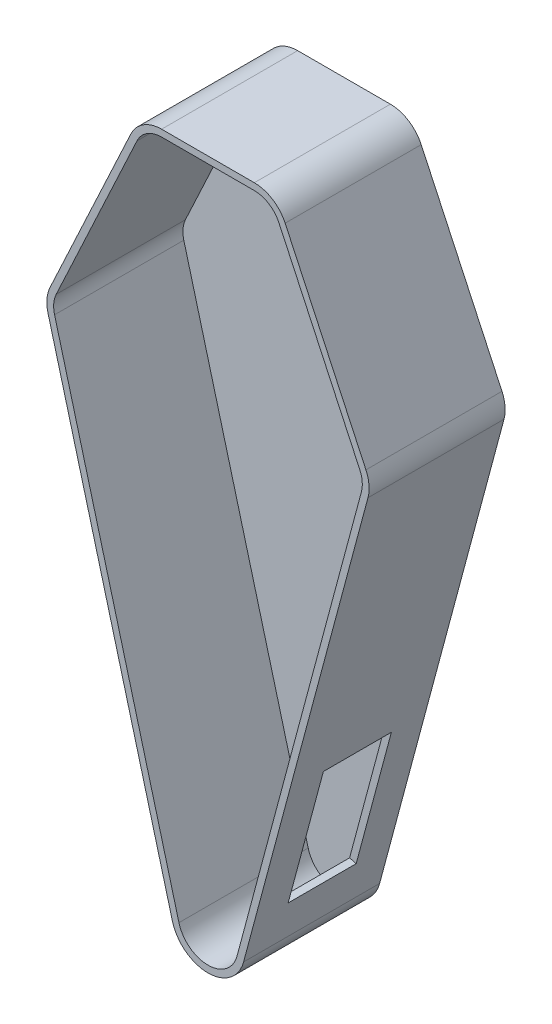
ISO-10303-21;
HEADER;
FILE_DESCRIPTION(('STEP AP214'),'2;1');
FILE_NAME('part.step','',(''),(''),'','','');
FILE_SCHEMA(('AUTOMOTIVE_DESIGN { 1 0 10303 214 1 1 1 1 }'));
ENDSEC;
DATA;
#1=APPLICATION_CONTEXT('core data for automotive mechanical design processes');
#2=APPLICATION_PROTOCOL_DEFINITION('international standard','automotive_design',2000,#1);
#3=PRODUCT_CONTEXT('',#1,'mechanical');
#4=PRODUCT('Part','Part','',(#3));
#5=PRODUCT_RELATED_PRODUCT_CATEGORY('part','',(#4));
#6=PRODUCT_DEFINITION_FORMATION('','',#4);
#7=PRODUCT_DEFINITION_CONTEXT('part definition',#1,'design');
#8=PRODUCT_DEFINITION('design','',#6,#7);
#9=PRODUCT_DEFINITION_SHAPE('','',#8);
#10=(LENGTH_UNIT() NAMED_UNIT(*) SI_UNIT(.MILLI.,.METRE.));
#11=(NAMED_UNIT(*) PLANE_ANGLE_UNIT() SI_UNIT($,.RADIAN.));
#12=(NAMED_UNIT(*) SI_UNIT($,.STERADIAN.) SOLID_ANGLE_UNIT());
#13=UNCERTAINTY_MEASURE_WITH_UNIT(LENGTH_MEASURE(1.E-05),#10,'distance_accuracy_value','');
#14=(GEOMETRIC_REPRESENTATION_CONTEXT(3) GLOBAL_UNCERTAINTY_ASSIGNED_CONTEXT((#13)) GLOBAL_UNIT_ASSIGNED_CONTEXT((#10,
#11,#12)) REPRESENTATION_CONTEXT('',''));
#15=CARTESIAN_POINT('',(0.,0.,0.));
#16=DIRECTION('',(0.,0.,1.));
#17=DIRECTION('',(1.,0.,0.));
#18=AXIS2_PLACEMENT_3D('',#15,#16,#17);
#19=CARTESIAN_POINT('',(0.,0.,20.));
#20=DIRECTION('',(-0.906307787036648,-0.422618261740704,0.));
#21=DIRECTION('',(0.422618261740704,-0.906307787036648,0.));
#22=AXIS2_PLACEMENT_3D('',#19,#20,#21);
#23=PLANE('',#22);
#24=DIRECTION('',(-0.422618261740704,0.906307787036648,0.));
#25=VECTOR('',#24,1.);
#26=CARTESIAN_POINT('',(0.,0.,20.));
#27=LINE('',#26,#25);
#28=CARTESIAN_POINT('',(13.2201274059954,-28.3506547121749,20.));
#29=VERTEX_POINT('',#28);
#30=CARTESIAN_POINT('',(1.34618763114579,-2.88690869129648,20.));
#31=VERTEX_POINT('',#30);
#32=EDGE_CURVE('E311',#29,#31,#27,.T.);
#33=ORIENTED_EDGE('',*,*,#32,.F.);
#34=DIRECTION('',(0.,0.,-1.));
#35=VECTOR('',#34,1.);
#36=CARTESIAN_POINT('',(13.2201274059954,-28.3506547121749,20.));
#37=LINE('',#36,#35);
#38=CARTESIAN_POINT('',(13.2201274059954,-28.3506547121749,0.));
#39=VERTEX_POINT('',#38);
#40=EDGE_CURVE('E374',#29,#39,#37,.T.);
#41=ORIENTED_EDGE('',*,*,#40,.T.);
#42=DIRECTION('',(-0.422618261740704,0.906307787036648,0.));
#43=VECTOR('',#42,1.);
#44=CARTESIAN_POINT('',(0.,0.,0.));
#45=LINE('',#44,#43);
#46=CARTESIAN_POINT('',(1.34618763114579,-2.88690869129648,0.));
#47=VERTEX_POINT('',#46);
#48=EDGE_CURVE('E273',#39,#47,#45,.T.);
#49=ORIENTED_EDGE('',*,*,#48,.T.);
#50=DIRECTION('',(0.,0.,-1.));
#51=VECTOR('',#50,1.);
#52=CARTESIAN_POINT('',(1.34618763114579,-2.88690869129648,20.));
#53=LINE('',#52,#51);
#54=EDGE_CURVE('E372',#47,#31,#53,.F.);
#55=ORIENTED_EDGE('',*,*,#54,.T.);
#56=EDGE_LOOP('',(#33,#41,#49,#55));
#57=FACE_BOUND('',#56,.T.);
#58=ADVANCED_FACE('F35',(#57),#23,.F.);
#59=CARTESIAN_POINT('',(0.,0.,20.));
#60=DIRECTION('',(0.,-1.,0.));
#61=DIRECTION('',(0.,0.,-1.));
#62=AXIS2_PLACEMENT_3D('',#59,#60,#61);
#63=PLANE('',#62);
#64=DIRECTION('',(-1.,0.,0.));
#65=VECTOR('',#64,1.);
#66=CARTESIAN_POINT('',(0.,0.,20.));
#67=LINE('',#66,#65);
#68=CARTESIAN_POINT('',(-3.18535130403745,0.,20.));
#69=VERTEX_POINT('',#68);
#70=CARTESIAN_POINT('',(-16.8146486959625,0.,20.));
#71=VERTEX_POINT('',#70);
#72=EDGE_CURVE('E314',#69,#71,#67,.T.);
#73=ORIENTED_EDGE('',*,*,#72,.F.);
#74=DIRECTION('',(0.,0.,-1.));
#75=VECTOR('',#74,1.);
#76=CARTESIAN_POINT('',(-3.18535130403745,0.,20.));
#77=LINE('',#76,#75);
#78=CARTESIAN_POINT('',(-3.18535130403745,0.,0.));
#79=VERTEX_POINT('',#78);
#80=EDGE_CURVE('E11',#69,#79,#77,.T.);
#81=ORIENTED_EDGE('',*,*,#80,.T.);
#82=DIRECTION('',(-1.,0.,0.));
#83=VECTOR('',#82,1.);
#84=CARTESIAN_POINT('',(0.,0.,0.));
#85=LINE('',#84,#83);
#86=CARTESIAN_POINT('',(-16.8146486959625,0.,0.));
#87=VERTEX_POINT('',#86);
#88=EDGE_CURVE('E331',#79,#87,#85,.T.);
#89=ORIENTED_EDGE('',*,*,#88,.T.);
#90=DIRECTION('',(0.,0.,-1.));
#91=VECTOR('',#90,1.);
#92=CARTESIAN_POINT('',(-16.8146486959625,0.,20.));
#93=LINE('',#92,#91);
#94=EDGE_CURVE('E44',#87,#71,#93,.F.);
#95=ORIENTED_EDGE('',*,*,#94,.T.);
#96=EDGE_LOOP('',(#73,#81,#89,#95));
#97=FACE_BOUND('',#96,.T.);
#98=ADVANCED_FACE('F382',(#97),#63,.F.);
#99=CARTESIAN_POINT('',(-20.,0.,20.));
#100=DIRECTION('',(0.906307787036651,-0.422618261740697,0.));
#101=DIRECTION('',(0.422618261740697,0.906307787036651,0.));
#102=AXIS2_PLACEMENT_3D('',#99,#100,#101);
#103=PLANE('',#102);
#104=DIRECTION('',(-0.422618261740697,-0.906307787036651,0.));
#105=VECTOR('',#104,1.);
#106=CARTESIAN_POINT('',(-20.,0.,0.));
#107=LINE('',#106,#105);
#108=CARTESIAN_POINT('',(-21.3461876311458,-2.88690869129651,0.));
#109=VERTEX_POINT('',#108);
#110=CARTESIAN_POINT('',(-33.2201274059952,-28.3506547121749,0.));
#111=VERTEX_POINT('',#110);
#112=EDGE_CURVE('E334',#109,#111,#107,.T.);
#113=ORIENTED_EDGE('',*,*,#112,.T.);
#114=DIRECTION('',(0.,0.,-1.));
#115=VECTOR('',#114,1.);
#116=CARTESIAN_POINT('',(-33.2201274059952,-28.3506547121749,20.));
#117=LINE('',#116,#115);
#118=CARTESIAN_POINT('',(-33.2201274059952,-28.3506547121749,20.));
#119=VERTEX_POINT('',#118);
#120=EDGE_CURVE('E362',#111,#119,#117,.F.);
#121=ORIENTED_EDGE('',*,*,#120,.T.);
#122=DIRECTION('',(-0.422618261740697,-0.906307787036651,0.));
#123=VECTOR('',#122,1.);
#124=CARTESIAN_POINT('',(-20.,0.,20.));
#125=LINE('',#124,#123);
#126=CARTESIAN_POINT('',(-21.3461876311458,-2.88690869129651,20.));
#127=VERTEX_POINT('',#126);
#128=EDGE_CURVE('E318',#127,#119,#125,.T.);
#129=ORIENTED_EDGE('',*,*,#128,.F.);
#130=DIRECTION('',(0.,0.,-1.));
#131=VECTOR('',#130,1.);
#132=CARTESIAN_POINT('',(-21.3461876311458,-2.88690869129651,20.));
#133=LINE('',#132,#131);
#134=EDGE_CURVE('E359',#127,#109,#133,.T.);
#135=ORIENTED_EDGE('',*,*,#134,.T.);
#136=EDGE_LOOP('',(#113,#121,#129,#135));
#137=FACE_BOUND('',#136,.T.);
#138=ADVANCED_FACE('F394',(#137),#103,.F.);
#139=CARTESIAN_POINT('',(-33.9892297446499,-30.,20.));
#140=DIRECTION('',(0.965925826289069,0.258819045102518,0.));
#141=DIRECTION('',(-0.258819045102518,0.965925826289069,0.));
#142=AXIS2_PLACEMENT_3D('',#139,#140,#141);
#143=PLANE('',#142);
#144=DIRECTION('',(0.258819045102518,-0.965925826289069,0.));
#145=VECTOR('',#144,1.);
#146=CARTESIAN_POINT('',(-33.9892297446499,-30.,20.));
#147=LINE('',#146,#145);
#148=CARTESIAN_POINT('',(-33.5182176022573,-31.757841246391,20.));
#149=VERTEX_POINT('',#148);
#150=CARTESIAN_POINT('',(-15.2327862744715,-100.,20.));
#151=VERTEX_POINT('',#150);
#152=EDGE_CURVE('E321',#149,#151,#147,.T.);
#153=ORIENTED_EDGE('',*,*,#152,.F.);
#154=DIRECTION('',(0.,0.,-1.));
#155=VECTOR('',#154,1.);
#156=CARTESIAN_POINT('',(-33.5182176022573,-31.757841246391,20.));
#157=LINE('',#156,#155);
#158=CARTESIAN_POINT('',(-33.5182176022573,-31.757841246391,0.));
#159=VERTEX_POINT('',#158);
#160=EDGE_CURVE('E348',#149,#159,#157,.T.);
#161=ORIENTED_EDGE('',*,*,#160,.T.);
#162=DIRECTION('',(0.258819045102518,-0.965925826289069,0.));
#163=VECTOR('',#162,1.);
#164=CARTESIAN_POINT('',(-33.9892297446499,-30.,0.));
#165=LINE('',#164,#163);
#166=CARTESIAN_POINT('',(-15.2327862744715,-100.,0.));
#167=VERTEX_POINT('',#166);
#168=EDGE_CURVE('E337',#159,#167,#165,.T.);
#169=ORIENTED_EDGE('',*,*,#168,.T.);
#170=DIRECTION('',(0.,0.,-1.));
#171=VECTOR('',#170,1.);
#172=CARTESIAN_POINT('',(-15.2327862744715,-100.,20.));
#173=LINE('',#172,#171);
#174=EDGE_CURVE('E345',#151,#167,#173,.T.);
#175=ORIENTED_EDGE('',*,*,#174,.F.);
#176=EDGE_LOOP('',(#153,#161,#169,#175));
#177=FACE_BOUND('',#176,.T.);
#178=ADVANCED_FACE('F406',(#177),#143,.F.);
#179=CARTESIAN_POINT('',(-10.0000000000001,-98.5978791435907,20.));
#180=DIRECTION('',(0.,0.,-1.));
#181=DIRECTION('',(-1.,0.,0.));
#182=AXIS2_PLACEMENT_3D('',#179,#180,#181);
#183=CYLINDRICAL_SURFACE('',#182,5.41737898713702);
#184=CARTESIAN_POINT('',(-10.0000000000001,-98.5978791435907,0.));
#185=DIRECTION('',(0.,0.,1.));
#186=DIRECTION('',(1.,0.,0.));
#187=AXIS2_PLACEMENT_3D('',#184,#185,#186);
#188=CIRCLE('',#187,5.41737898713702);
#189=CARTESIAN_POINT('',(-4.76721372552876,-100.,0.));
#190=VERTEX_POINT('',#189);
#191=EDGE_CURVE('E339',#167,#190,#188,.T.);
#192=ORIENTED_EDGE('',*,*,#191,.T.);
#193=DIRECTION('',(0.,0.,-1.));
#194=VECTOR('',#193,1.);
#195=CARTESIAN_POINT('',(-4.76721372552876,-100.,20.));
#196=LINE('',#195,#194);
#197=CARTESIAN_POINT('',(-4.76721372552876,-100.,20.));
#198=VERTEX_POINT('',#197);
#199=EDGE_CURVE('E328',#198,#190,#196,.T.);
#200=ORIENTED_EDGE('',*,*,#199,.F.);
#201=CARTESIAN_POINT('',(-10.0000000000001,-98.5978791435907,20.));
#202=DIRECTION('',(0.,0.,1.));
#203=DIRECTION('',(1.,0.,0.));
#204=AXIS2_PLACEMENT_3D('',#201,#202,#203);
#205=CIRCLE('',#204,5.41737898713702);
#206=EDGE_CURVE('E323',#151,#198,#205,.T.);
#207=ORIENTED_EDGE('',*,*,#206,.F.);
#208=ORIENTED_EDGE('',*,*,#174,.T.);
#209=EDGE_LOOP('',(#192,#200,#207,#208));
#210=FACE_BOUND('',#209,.T.);
#211=ADVANCED_FACE('F413',(#210),#183,.T.);
#212=CARTESIAN_POINT('',(13.9892297446501,-30.,20.));
#213=DIRECTION('',(-0.965925826289067,0.258819045102525,0.));
#214=DIRECTION('',(-0.258819045102525,-0.965925826289067,0.));
#215=AXIS2_PLACEMENT_3D('',#212,#213,#214);
#216=PLANE('',#215);
#217=DIRECTION('',(0.258819045102525,0.965925826289067,0.));
#218=VECTOR('',#217,1.);
#219=CARTESIAN_POINT('',(1.96208144713689,-74.8859285164842,5.));
#220=LINE('',#219,#218);
#221=CARTESIAN_POINT('',(-3.21429945491361,-94.2044450422656,5.));
#222=VERTEX_POINT('',#221);
#223=CARTESIAN_POINT('',(1.96208144713689,-74.8859285164842,5.));
#224=VERTEX_POINT('',#223);
#225=EDGE_CURVE('E212',#222,#224,#220,.T.);
#226=ORIENTED_EDGE('',*,*,#225,.F.);
#227=DIRECTION('',(0.,0.,-1.));
#228=VECTOR('',#227,1.);
#229=CARTESIAN_POINT('',(-3.21429945491361,-94.2044450422656,15.));
#230=LINE('',#229,#228);
#231=CARTESIAN_POINT('',(-3.21429945491361,-94.2044450422656,15.));
#232=VERTEX_POINT('',#231);
#233=EDGE_CURVE('E224',#232,#222,#230,.T.);
#234=ORIENTED_EDGE('',*,*,#233,.F.);
#235=DIRECTION('',(-0.258819045102525,-0.965925826289067,0.));
#236=VECTOR('',#235,1.);
#237=CARTESIAN_POINT('',(1.96208144713689,-74.8859285164842,15.));
#238=LINE('',#237,#236);
#239=CARTESIAN_POINT('',(1.96208144713689,-74.8859285164842,15.));
#240=VERTEX_POINT('',#239);
#241=EDGE_CURVE('E222',#240,#232,#238,.T.);
#242=ORIENTED_EDGE('',*,*,#241,.F.);
#243=DIRECTION('',(0.,0.,1.));
#244=VECTOR('',#243,1.);
#245=CARTESIAN_POINT('',(1.96208144713689,-74.8859285164842,15.));
#246=LINE('',#245,#244);
#247=EDGE_CURVE('E51',#224,#240,#246,.T.);
#248=ORIENTED_EDGE('',*,*,#247,.F.);
#249=EDGE_LOOP('',(#226,#234,#242,#248));
#250=FACE_BOUND('',#249,.T.);
#251=DIRECTION('',(0.258819045102525,0.965925826289067,0.));
#252=VECTOR('',#251,1.);
#253=CARTESIAN_POINT('',(13.9892297446501,-30.,0.));
#254=LINE('',#253,#252);
#255=CARTESIAN_POINT('',(13.5182176022575,-31.7578412463911,0.));
#256=VERTEX_POINT('',#255);
#257=EDGE_CURVE('E315',#190,#256,#254,.T.);
#258=ORIENTED_EDGE('',*,*,#257,.T.);
#259=DIRECTION('',(0.,0.,-1.));
#260=VECTOR('',#259,1.);
#261=CARTESIAN_POINT('',(13.5182176022575,-31.7578412463911,20.));
#262=LINE('',#261,#260);
#263=CARTESIAN_POINT('',(13.5182176022575,-31.7578412463911,20.));
#264=VERTEX_POINT('',#263);
#265=EDGE_CURVE('E377',#256,#264,#262,.F.);
#266=ORIENTED_EDGE('',*,*,#265,.T.);
#267=DIRECTION('',(0.258819045102525,0.965925826289067,0.));
#268=VECTOR('',#267,1.);
#269=CARTESIAN_POINT('',(13.9892297446501,-30.,20.));
#270=LINE('',#269,#268);
#271=EDGE_CURVE('E325',#198,#264,#270,.T.);
#272=ORIENTED_EDGE('',*,*,#271,.F.);
#273=ORIENTED_EDGE('',*,*,#199,.T.);
#274=EDGE_LOOP('',(#258,#266,#272,#273));
#275=FACE_BOUND('',#274,.T.);
#276=ADVANCED_FACE('F416',(#250,#275),#216,.F.);
#277=CARTESIAN_POINT('',(-10.0000000000001,-98.5978791435907,20.));
#278=DIRECTION('',(0.,0.,1.));
#279=DIRECTION('',(1.,0.,0.));
#280=AXIS2_PLACEMENT_3D('',#277,#278,#279);
#281=PLANE('',#280);
#282=DIRECTION('',(-0.422618261740697,-0.906307787036651,0.));
#283=VECTOR('',#282,1.);
#284=CARTESIAN_POINT('',(-19.0936922129634,-0.422618261740697,20.));
#285=LINE('',#284,#283);
#286=CARTESIAN_POINT('',(-20.4398798441091,-3.30952695303721,20.));
#287=VERTEX_POINT('',#286);
#288=CARTESIAN_POINT('',(-32.3138196189585,-28.7732729739156,20.));
#289=VERTEX_POINT('',#288);
#290=EDGE_CURVE('E299',#287,#289,#285,.T.);
#291=ORIENTED_EDGE('',*,*,#290,.F.);
#292=CARTESIAN_POINT('',(-16.8146486959625,-5.,20.));
#293=DIRECTION('',(0.,0.,1.));
#294=DIRECTION('',(1.,0.,0.));
#295=AXIS2_PLACEMENT_3D('',#292,#293,#294);
#296=CIRCLE('',#295,4.);
#297=CARTESIAN_POINT('',(-16.8146486959625,-1.,20.));
#298=VERTEX_POINT('',#297);
#299=EDGE_CURVE('E281',#298,#287,#296,.T.);
#300=ORIENTED_EDGE('',*,*,#299,.F.);
#301=DIRECTION('',(-1.,0.,0.));
#302=VECTOR('',#301,1.);
#303=CARTESIAN_POINT('',(0.,-1.,20.));
#304=LINE('',#303,#302);
#305=CARTESIAN_POINT('',(-3.18535130403745,-1.,20.));
#306=VERTEX_POINT('',#305);
#307=EDGE_CURVE('E294',#306,#298,#304,.T.);
#308=ORIENTED_EDGE('',*,*,#307,.F.);
#309=CARTESIAN_POINT('',(-3.18535130403745,-5.,20.));
#310=DIRECTION('',(0.,0.,1.));
#311=DIRECTION('',(1.,0.,0.));
#312=AXIS2_PLACEMENT_3D('',#309,#310,#311);
#313=CIRCLE('',#312,4.);
#314=CARTESIAN_POINT('',(0.439879844109143,-3.30952695303718,20.));
#315=VERTEX_POINT('',#314);
#316=EDGE_CURVE('E295',#315,#306,#313,.T.);
#317=ORIENTED_EDGE('',*,*,#316,.F.);
#318=DIRECTION('',(-0.422618261740704,0.906307787036648,0.));
#319=VECTOR('',#318,1.);
#320=CARTESIAN_POINT('',(-0.906307787036648,-0.422618261740704,20.));
#321=LINE('',#320,#319);
#322=CARTESIAN_POINT('',(12.3138196189588,-28.7732729739156,20.));
#323=VERTEX_POINT('',#322);
#324=EDGE_CURVE('E268',#323,#315,#321,.T.);
#325=ORIENTED_EDGE('',*,*,#324,.F.);
#326=CARTESIAN_POINT('',(8.6885884708122,-30.4637460208784,20.));
#327=DIRECTION('',(0.,0.,1.));
#328=DIRECTION('',(1.,0.,0.));
#329=AXIS2_PLACEMENT_3D('',#326,#327,#328);
#330=CIRCLE('',#329,4.);
#331=CARTESIAN_POINT('',(12.5522917759685,-31.4990222012885,20.));
#332=VERTEX_POINT('',#331);
#333=EDGE_CURVE('E297',#332,#323,#330,.T.);
#334=ORIENTED_EDGE('',*,*,#333,.F.);
#335=DIRECTION('',(0.258819045102525,0.965925826289067,0.));
#336=VECTOR('',#335,1.);
#337=CARTESIAN_POINT('',(13.0233039183611,-29.7411809548975,20.));
#338=LINE('',#337,#336);
#339=CARTESIAN_POINT('',(-5.73313955181782,-99.7411809548975,20.));
#340=VERTEX_POINT('',#339);
#341=EDGE_CURVE('E290',#340,#332,#338,.T.);
#342=ORIENTED_EDGE('',*,*,#341,.F.);
#343=CARTESIAN_POINT('',(-10.0000000000001,-98.5978791435907,20.));
#344=DIRECTION('',(0.,0.,1.));
#345=DIRECTION('',(1.,0.,0.));
#346=AXIS2_PLACEMENT_3D('',#343,#344,#345);
#347=CIRCLE('',#346,4.41737898713702);
#348=CARTESIAN_POINT('',(-14.2668604481824,-99.7411809548975,20.));
#349=VERTEX_POINT('',#348);
#350=EDGE_CURVE('E306',#349,#340,#347,.T.);
#351=ORIENTED_EDGE('',*,*,#350,.F.);
#352=DIRECTION('',(0.258819045102518,-0.965925826289069,0.));
#353=VECTOR('',#352,1.);
#354=CARTESIAN_POINT('',(-33.0233039183608,-29.7411809548975,20.));
#355=LINE('',#354,#353);
#356=CARTESIAN_POINT('',(-32.5522917759682,-31.4990222012885,20.));
#357=VERTEX_POINT('',#356);
#358=EDGE_CURVE('E303',#357,#349,#355,.T.);
#359=ORIENTED_EDGE('',*,*,#358,.F.);
#360=CARTESIAN_POINT('',(-28.6885884708119,-30.4637460208784,20.));
#361=DIRECTION('',(0.,0.,1.));
#362=DIRECTION('',(1.,0.,0.));
#363=AXIS2_PLACEMENT_3D('',#360,#361,#362);
#364=CIRCLE('',#363,4.);
#365=EDGE_CURVE('E246',#289,#357,#364,.T.);
#366=ORIENTED_EDGE('',*,*,#365,.F.);
#367=EDGE_LOOP('',(#291,#300,#308,#317,#325,#334,#342,#351,#359,#366));
#368=FACE_BOUND('',#367,.T.);
#369=ORIENTED_EDGE('',*,*,#128,.T.);
#370=CARTESIAN_POINT('',(-28.6885884708119,-30.4637460208784,20.));
#371=DIRECTION('',(0.,0.,1.));
#372=DIRECTION('',(1.,0.,0.));
#373=AXIS2_PLACEMENT_3D('',#370,#371,#372);
#374=CIRCLE('',#373,5.);
#375=EDGE_CURVE('E370',#119,#149,#374,.T.);
#376=ORIENTED_EDGE('',*,*,#375,.T.);
#377=ORIENTED_EDGE('',*,*,#152,.T.);
#378=ORIENTED_EDGE('',*,*,#206,.T.);
#379=ORIENTED_EDGE('',*,*,#271,.T.);
#380=CARTESIAN_POINT('',(8.6885884708122,-30.4637460208784,20.));
#381=DIRECTION('',(0.,0.,1.));
#382=DIRECTION('',(1.,0.,0.));
#383=AXIS2_PLACEMENT_3D('',#380,#381,#382);
#384=CIRCLE('',#383,5.);
#385=EDGE_CURVE('E368',#264,#29,#384,.T.);
#386=ORIENTED_EDGE('',*,*,#385,.T.);
#387=ORIENTED_EDGE('',*,*,#32,.T.);
#388=CARTESIAN_POINT('',(-3.18535130403745,-5.,20.));
#389=DIRECTION('',(0.,0.,1.));
#390=DIRECTION('',(1.,0.,0.));
#391=AXIS2_PLACEMENT_3D('',#388,#389,#390);
#392=CIRCLE('',#391,5.);
#393=EDGE_CURVE('E366',#31,#69,#392,.T.);
#394=ORIENTED_EDGE('',*,*,#393,.T.);
#395=ORIENTED_EDGE('',*,*,#72,.T.);
#396=CARTESIAN_POINT('',(-16.8146486959625,-5.,20.));
#397=DIRECTION('',(0.,0.,1.));
#398=DIRECTION('',(1.,0.,0.));
#399=AXIS2_PLACEMENT_3D('',#396,#397,#398);
#400=CIRCLE('',#399,5.);
#401=EDGE_CURVE('E364',#71,#127,#400,.T.);
#402=ORIENTED_EDGE('',*,*,#401,.T.);
#403=EDGE_LOOP('',(#369,#376,#377,#378,#379,#386,#387,#394,#395,#402));
#404=FACE_BOUND('',#403,.T.);
#405=ADVANCED_FACE('F388',(#368,#404),#281,.T.);
#406=CARTESIAN_POINT('',(-10.0000000000001,-98.5978791435907,0.));
#407=DIRECTION('',(0.,0.,1.));
#408=DIRECTION('',(1.,0.,0.));
#409=AXIS2_PLACEMENT_3D('',#406,#407,#408);
#410=PLANE('',#409);
#411=CARTESIAN_POINT('',(-9.99999999999999,-12.,0.));
#412=DIRECTION('',(0.,0.,-1.));
#413=DIRECTION('',(-1.,0.,0.));
#414=AXIS2_PLACEMENT_3D('',#411,#412,#413);
#415=CIRCLE('',#414,5.);
#416=CARTESIAN_POINT('',(-15.,-12.,0.));
#417=VERTEX_POINT('',#416);
#418=EDGE_CURVE('E233',#417,#417,#415,.T.);
#419=ORIENTED_EDGE('',*,*,#418,.F.);
#420=EDGE_LOOP('',(#419));
#421=FACE_BOUND('',#420,.T.);
#422=ORIENTED_EDGE('',*,*,#168,.F.);
#423=CARTESIAN_POINT('',(-28.6885884708119,-30.4637460208784,0.));
#424=DIRECTION('',(0.,0.,1.));
#425=DIRECTION('',(1.,0.,0.));
#426=AXIS2_PLACEMENT_3D('',#423,#424,#425);
#427=CIRCLE('',#426,5.);
#428=EDGE_CURVE('E357',#159,#111,#427,.F.);
#429=ORIENTED_EDGE('',*,*,#428,.T.);
#430=ORIENTED_EDGE('',*,*,#112,.F.);
#431=CARTESIAN_POINT('',(-16.8146486959625,-5.,0.));
#432=DIRECTION('',(0.,0.,1.));
#433=DIRECTION('',(1.,0.,0.));
#434=AXIS2_PLACEMENT_3D('',#431,#432,#433);
#435=CIRCLE('',#434,5.);
#436=EDGE_CURVE('E351',#109,#87,#435,.F.);
#437=ORIENTED_EDGE('',*,*,#436,.T.);
#438=ORIENTED_EDGE('',*,*,#88,.F.);
#439=CARTESIAN_POINT('',(-3.18535130403745,-5.,0.));
#440=DIRECTION('',(0.,0.,1.));
#441=DIRECTION('',(1.,0.,0.));
#442=AXIS2_PLACEMENT_3D('',#439,#440,#441);
#443=CIRCLE('',#442,5.);
#444=EDGE_CURVE('E353',#79,#47,#443,.F.);
#445=ORIENTED_EDGE('',*,*,#444,.T.);
#446=ORIENTED_EDGE('',*,*,#48,.F.);
#447=CARTESIAN_POINT('',(8.6885884708122,-30.4637460208784,0.));
#448=DIRECTION('',(0.,0.,1.));
#449=DIRECTION('',(1.,0.,0.));
#450=AXIS2_PLACEMENT_3D('',#447,#448,#449);
#451=CIRCLE('',#450,5.);
#452=EDGE_CURVE('E355',#39,#256,#451,.F.);
#453=ORIENTED_EDGE('',*,*,#452,.T.);
#454=ORIENTED_EDGE('',*,*,#257,.F.);
#455=ORIENTED_EDGE('',*,*,#191,.F.);
#456=EDGE_LOOP('',(#422,#429,#430,#437,#438,#445,#446,#453,#454,#455));
#457=FACE_BOUND('',#456,.T.);
#458=ADVANCED_FACE('F398',(#421,#457),#410,.F.);
#459=CARTESIAN_POINT('',(-28.6885884708119,-30.4637460208784,20.));
#460=DIRECTION('',(0.,0.,-1.));
#461=DIRECTION('',(-1.,0.,0.));
#462=AXIS2_PLACEMENT_3D('',#459,#460,#461);
#463=CYLINDRICAL_SURFACE('',#462,5.);
#464=ORIENTED_EDGE('',*,*,#375,.F.);
#465=ORIENTED_EDGE('',*,*,#120,.F.);
#466=ORIENTED_EDGE('',*,*,#428,.F.);
#467=ORIENTED_EDGE('',*,*,#160,.F.);
#468=EDGE_LOOP('',(#464,#465,#466,#467));
#469=FACE_BOUND('',#468,.T.);
#470=ADVANCED_FACE('F403',(#469),#463,.T.);
#471=CARTESIAN_POINT('',(8.6885884708122,-30.4637460208784,20.));
#472=DIRECTION('',(0.,0.,-1.));
#473=DIRECTION('',(-1.,0.,0.));
#474=AXIS2_PLACEMENT_3D('',#471,#472,#473);
#475=CYLINDRICAL_SURFACE('',#474,5.);
#476=ORIENTED_EDGE('',*,*,#385,.F.);
#477=ORIENTED_EDGE('',*,*,#265,.F.);
#478=ORIENTED_EDGE('',*,*,#452,.F.);
#479=ORIENTED_EDGE('',*,*,#40,.F.);
#480=EDGE_LOOP('',(#476,#477,#478,#479));
#481=FACE_BOUND('',#480,.T.);
#482=ADVANCED_FACE('F419',(#481),#475,.T.);
#483=CARTESIAN_POINT('',(-3.18535130403745,-5.,20.));
#484=DIRECTION('',(0.,0.,-1.));
#485=DIRECTION('',(-1.,0.,0.));
#486=AXIS2_PLACEMENT_3D('',#483,#484,#485);
#487=CYLINDRICAL_SURFACE('',#486,5.);
#488=ORIENTED_EDGE('',*,*,#393,.F.);
#489=ORIENTED_EDGE('',*,*,#54,.F.);
#490=ORIENTED_EDGE('',*,*,#444,.F.);
#491=ORIENTED_EDGE('',*,*,#80,.F.);
#492=EDGE_LOOP('',(#488,#489,#490,#491));
#493=FACE_BOUND('',#492,.T.);
#494=ADVANCED_FACE('F426',(#493),#487,.T.);
#495=CARTESIAN_POINT('',(-16.8146486959625,-5.,20.));
#496=DIRECTION('',(0.,0.,-1.));
#497=DIRECTION('',(-1.,0.,0.));
#498=AXIS2_PLACEMENT_3D('',#495,#496,#497);
#499=CYLINDRICAL_SURFACE('',#498,5.);
#500=ORIENTED_EDGE('',*,*,#401,.F.);
#501=ORIENTED_EDGE('',*,*,#94,.F.);
#502=ORIENTED_EDGE('',*,*,#436,.F.);
#503=ORIENTED_EDGE('',*,*,#134,.F.);
#504=EDGE_LOOP('',(#500,#501,#502,#503));
#505=FACE_BOUND('',#504,.T.);
#506=ADVANCED_FACE('F37',(#505),#499,.T.);
#507=CARTESIAN_POINT('',(-0.906307787036648,-0.422618261740704,20.));
#508=DIRECTION('',(-0.906307787036648,-0.422618261740704,0.));
#509=DIRECTION('',(0.422618261740704,-0.906307787036648,0.));
#510=AXIS2_PLACEMENT_3D('',#507,#508,#509);
#511=PLANE('',#510);
#512=ORIENTED_EDGE('',*,*,#324,.T.);
#513=DIRECTION('',(0.,0.,1.));
#514=VECTOR('',#513,1.);
#515=CARTESIAN_POINT('',(0.439879844109143,-3.30952695303718,20.));
#516=LINE('',#515,#514);
#517=CARTESIAN_POINT('',(0.439879844109143,-3.30952695303718,1.));
#518=VERTEX_POINT('',#517);
#519=EDGE_CURVE('E240',#518,#315,#516,.T.);
#520=ORIENTED_EDGE('',*,*,#519,.F.);
#521=DIRECTION('',(-0.422618261740704,0.906307787036648,0.));
#522=VECTOR('',#521,1.);
#523=CARTESIAN_POINT('',(-0.906307787036648,-0.422618261740704,1.));
#524=LINE('',#523,#522);
#525=CARTESIAN_POINT('',(12.3138196189588,-28.7732729739156,1.));
#526=VERTEX_POINT('',#525);
#527=EDGE_CURVE('E241',#526,#518,#524,.T.);
#528=ORIENTED_EDGE('',*,*,#527,.F.);
#529=DIRECTION('',(0.,0.,1.));
#530=VECTOR('',#529,1.);
#531=CARTESIAN_POINT('',(12.3138196189588,-28.7732729739156,20.));
#532=LINE('',#531,#530);
#533=EDGE_CURVE('E236',#323,#526,#532,.F.);
#534=ORIENTED_EDGE('',*,*,#533,.F.);
#535=EDGE_LOOP('',(#512,#520,#528,#534));
#536=FACE_BOUND('',#535,.T.);
#537=ADVANCED_FACE('F432',(#536),#511,.T.);
#538=CARTESIAN_POINT('',(0.,-1.,20.));
#539=DIRECTION('',(0.,-1.,0.));
#540=DIRECTION('',(0.,0.,-1.));
#541=AXIS2_PLACEMENT_3D('',#538,#539,#540);
#542=PLANE('',#541);
#543=ORIENTED_EDGE('',*,*,#307,.T.);
#544=DIRECTION('',(0.,0.,-1.));
#545=VECTOR('',#544,1.);
#546=CARTESIAN_POINT('',(-16.8146486959625,-1.,20.));
#547=LINE('',#546,#545);
#548=CARTESIAN_POINT('',(-16.8146486959625,-1.,1.));
#549=VERTEX_POINT('',#548);
#550=EDGE_CURVE('E274',#549,#298,#547,.F.);
#551=ORIENTED_EDGE('',*,*,#550,.F.);
#552=DIRECTION('',(-1.,0.,0.));
#553=VECTOR('',#552,1.);
#554=CARTESIAN_POINT('',(0.,-1.,1.));
#555=LINE('',#554,#553);
#556=CARTESIAN_POINT('',(-3.18535130403745,-1.,1.));
#557=VERTEX_POINT('',#556);
#558=EDGE_CURVE('E244',#557,#549,#555,.T.);
#559=ORIENTED_EDGE('',*,*,#558,.F.);
#560=DIRECTION('',(0.,0.,-1.));
#561=VECTOR('',#560,1.);
#562=CARTESIAN_POINT('',(-3.18535130403745,-1.,20.));
#563=LINE('',#562,#561);
#564=EDGE_CURVE('E270',#306,#557,#563,.T.);
#565=ORIENTED_EDGE('',*,*,#564,.F.);
#566=EDGE_LOOP('',(#543,#551,#559,#565));
#567=FACE_BOUND('',#566,.T.);
#568=ADVANCED_FACE('F498',(#567),#542,.T.);
#569=CARTESIAN_POINT('',(-19.0936922129634,-0.422618261740697,20.));
#570=DIRECTION('',(0.906307787036651,-0.422618261740697,0.));
#571=DIRECTION('',(0.422618261740697,0.906307787036651,0.));
#572=AXIS2_PLACEMENT_3D('',#569,#570,#571);
#573=PLANE('',#572);
#574=DIRECTION('',(-0.422618261740697,-0.906307787036651,0.));
#575=VECTOR('',#574,1.);
#576=CARTESIAN_POINT('',(-19.0936922129634,-0.422618261740697,1.));
#577=LINE('',#576,#575);
#578=CARTESIAN_POINT('',(-20.4398798441091,-3.30952695303721,1.));
#579=VERTEX_POINT('',#578);
#580=CARTESIAN_POINT('',(-32.3138196189585,-28.7732729739156,1.));
#581=VERTEX_POINT('',#580);
#582=EDGE_CURVE('E250',#579,#581,#577,.T.);
#583=ORIENTED_EDGE('',*,*,#582,.F.);
#584=DIRECTION('',(0.,0.,1.));
#585=VECTOR('',#584,1.);
#586=CARTESIAN_POINT('',(-20.4398798441091,-3.30952695303721,20.));
#587=LINE('',#586,#585);
#588=EDGE_CURVE('E253',#287,#579,#587,.F.);
#589=ORIENTED_EDGE('',*,*,#588,.F.);
#590=ORIENTED_EDGE('',*,*,#290,.T.);
#591=DIRECTION('',(0.,0.,1.));
#592=VECTOR('',#591,1.);
#593=CARTESIAN_POINT('',(-32.3138196189585,-28.7732729739156,20.));
#594=LINE('',#593,#592);
#595=EDGE_CURVE('E279',#581,#289,#594,.T.);
#596=ORIENTED_EDGE('',*,*,#595,.F.);
#597=EDGE_LOOP('',(#583,#589,#590,#596));
#598=FACE_BOUND('',#597,.T.);
#599=ADVANCED_FACE('F508',(#598),#573,.T.);
#600=CARTESIAN_POINT('',(-33.0233039183608,-29.7411809548975,20.));
#601=DIRECTION('',(0.965925826289069,0.258819045102518,0.));
#602=DIRECTION('',(-0.258819045102518,0.965925826289069,0.));
#603=AXIS2_PLACEMENT_3D('',#600,#601,#602);
#604=PLANE('',#603);
#605=ORIENTED_EDGE('',*,*,#358,.T.);
#606=DIRECTION('',(0.,0.,-1.));
#607=VECTOR('',#606,1.);
#608=CARTESIAN_POINT('',(-14.2668604481824,-99.7411809548975,20.));
#609=LINE('',#608,#607);
#610=CARTESIAN_POINT('',(-14.2668604481824,-99.7411809548975,1.));
#611=VERTEX_POINT('',#610);
#612=EDGE_CURVE('E284',#349,#611,#609,.T.);
#613=ORIENTED_EDGE('',*,*,#612,.T.);
#614=DIRECTION('',(0.258819045102518,-0.965925826289069,0.));
#615=VECTOR('',#614,1.);
#616=CARTESIAN_POINT('',(-33.0233039183608,-29.7411809548975,1.));
#617=LINE('',#616,#615);
#618=CARTESIAN_POINT('',(-32.5522917759682,-31.4990222012885,1.));
#619=VERTEX_POINT('',#618);
#620=EDGE_CURVE('E247',#619,#611,#617,.T.);
#621=ORIENTED_EDGE('',*,*,#620,.F.);
#622=DIRECTION('',(0.,0.,1.));
#623=VECTOR('',#622,1.);
#624=CARTESIAN_POINT('',(-32.5522917759682,-31.4990222012885,20.));
#625=LINE('',#624,#623);
#626=EDGE_CURVE('E260',#357,#619,#625,.F.);
#627=ORIENTED_EDGE('',*,*,#626,.F.);
#628=EDGE_LOOP('',(#605,#613,#621,#627));
#629=FACE_BOUND('',#628,.T.);
#630=ADVANCED_FACE('F518',(#629),#604,.T.);
#631=CARTESIAN_POINT('',(-10.0000000000001,-98.5978791435907,20.));
#632=DIRECTION('',(0.,0.,-1.));
#633=DIRECTION('',(-1.,0.,0.));
#634=AXIS2_PLACEMENT_3D('',#631,#632,#633);
#635=CYLINDRICAL_SURFACE('',#634,4.41737898713702);
#636=CARTESIAN_POINT('',(-10.0000000000001,-98.5978791435907,1.));
#637=DIRECTION('',(0.,0.,1.));
#638=DIRECTION('',(1.,0.,0.));
#639=AXIS2_PLACEMENT_3D('',#636,#637,#638);
#640=CIRCLE('',#639,4.41737898713702);
#641=CARTESIAN_POINT('',(-5.73313955181783,-99.7411809548975,1.));
#642=VERTEX_POINT('',#641);
#643=EDGE_CURVE('E249',#611,#642,#640,.T.);
#644=ORIENTED_EDGE('',*,*,#643,.F.);
#645=ORIENTED_EDGE('',*,*,#612,.F.);
#646=ORIENTED_EDGE('',*,*,#350,.T.);
#647=DIRECTION('',(0.,0.,1.));
#648=VECTOR('',#647,1.);
#649=CARTESIAN_POINT('',(-5.73313955181783,-99.7411809548975,20.));
#650=LINE('',#649,#648);
#651=EDGE_CURVE('E287',#340,#642,#650,.F.);
#652=ORIENTED_EDGE('',*,*,#651,.T.);
#653=EDGE_LOOP('',(#644,#645,#646,#652));
#654=FACE_BOUND('',#653,.T.);
#655=ADVANCED_FACE('F528',(#654),#635,.F.);
#656=CARTESIAN_POINT('',(13.0233039183611,-29.7411809548975,20.));
#657=DIRECTION('',(-0.965925826289067,0.258819045102525,0.));
#658=DIRECTION('',(-0.258819045102525,-0.965925826289067,0.));
#659=AXIS2_PLACEMENT_3D('',#656,#657,#658);
#660=PLANE('',#659);
#661=DIRECTION('',(0.,0.,-1.));
#662=VECTOR('',#661,1.);
#663=CARTESIAN_POINT('',(-4.18022528120268,-93.9456259971631,15.));
#664=LINE('',#663,#662);
#665=CARTESIAN_POINT('',(-4.18022528120269,-93.9456259971631,15.));
#666=VERTEX_POINT('',#665);
#667=CARTESIAN_POINT('',(-4.18022528120268,-93.9456259971631,5.));
#668=VERTEX_POINT('',#667);
#669=EDGE_CURVE('E218',#666,#668,#664,.T.);
#670=ORIENTED_EDGE('',*,*,#669,.T.);
#671=DIRECTION('',(0.258819045102525,0.965925826289067,0.));
#672=VECTOR('',#671,1.);
#673=CARTESIAN_POINT('',(0.99615562084783,-74.6271094713817,5.));
#674=LINE('',#673,#672);
#675=CARTESIAN_POINT('',(0.996155620847826,-74.6271094713817,5.));
#676=VERTEX_POINT('',#675);
#677=EDGE_CURVE('E206',#668,#676,#674,.T.);
#678=ORIENTED_EDGE('',*,*,#677,.T.);
#679=DIRECTION('',(0.,0.,1.));
#680=VECTOR('',#679,1.);
#681=CARTESIAN_POINT('',(0.99615562084783,-74.6271094713817,15.));
#682=LINE('',#681,#680);
#683=CARTESIAN_POINT('',(0.99615562084783,-74.6271094713817,15.));
#684=VERTEX_POINT('',#683);
#685=EDGE_CURVE('E196',#676,#684,#682,.T.);
#686=ORIENTED_EDGE('',*,*,#685,.T.);
#687=DIRECTION('',(-0.258819045102525,-0.965925826289067,0.));
#688=VECTOR('',#687,1.);
#689=CARTESIAN_POINT('',(0.99615562084783,-74.6271094713817,15.));
#690=LINE('',#689,#688);
#691=EDGE_CURVE('E205',#684,#666,#690,.T.);
#692=ORIENTED_EDGE('',*,*,#691,.T.);
#693=EDGE_LOOP('',(#670,#678,#686,#692));
#694=FACE_BOUND('',#693,.T.);
#695=DIRECTION('',(0.258819045102525,0.965925826289067,0.));
#696=VECTOR('',#695,1.);
#697=CARTESIAN_POINT('',(13.0233039183611,-29.7411809548975,1.));
#698=LINE('',#697,#696);
#699=CARTESIAN_POINT('',(12.5522917759685,-31.4990222012885,1.));
#700=VERTEX_POINT('',#699);
#701=EDGE_CURVE('E265',#642,#700,#698,.T.);
#702=ORIENTED_EDGE('',*,*,#701,.F.);
#703=ORIENTED_EDGE('',*,*,#651,.F.);
#704=ORIENTED_EDGE('',*,*,#341,.T.);
#705=DIRECTION('',(0.,0.,1.));
#706=VECTOR('',#705,1.);
#707=CARTESIAN_POINT('',(12.5522917759685,-31.4990222012885,20.));
#708=LINE('',#707,#706);
#709=EDGE_CURVE('E239',#700,#332,#708,.T.);
#710=ORIENTED_EDGE('',*,*,#709,.F.);
#711=EDGE_LOOP('',(#702,#703,#704,#710));
#712=FACE_BOUND('',#711,.T.);
#713=ADVANCED_FACE('F216',(#694,#712),#660,.T.);
#714=CARTESIAN_POINT('',(-10.0000000000001,-98.5978791435907,1.));
#715=DIRECTION('',(0.,0.,1.));
#716=DIRECTION('',(1.,0.,0.));
#717=AXIS2_PLACEMENT_3D('',#714,#715,#716);
#718=PLANE('',#717);
#719=CARTESIAN_POINT('',(-9.99999999999999,-12.,1.));
#720=DIRECTION('',(0.,0.,1.));
#721=DIRECTION('',(1.,0.,0.));
#722=AXIS2_PLACEMENT_3D('',#719,#720,#721);
#723=CIRCLE('',#722,5.);
#724=CARTESIAN_POINT('',(-4.99999999999999,-12.,1.));
#725=VERTEX_POINT('',#724);
#726=EDGE_CURVE('E39',#725,#725,#723,.T.);
#727=ORIENTED_EDGE('',*,*,#726,.F.);
#728=EDGE_LOOP('',(#727));
#729=FACE_BOUND('',#728,.T.);
#730=ORIENTED_EDGE('',*,*,#620,.T.);
#731=ORIENTED_EDGE('',*,*,#643,.T.);
#732=ORIENTED_EDGE('',*,*,#701,.T.);
#733=CARTESIAN_POINT('',(8.6885884708122,-30.4637460208784,1.));
#734=DIRECTION('',(0.,0.,1.));
#735=DIRECTION('',(1.,0.,0.));
#736=AXIS2_PLACEMENT_3D('',#733,#734,#735);
#737=CIRCLE('',#736,4.);
#738=EDGE_CURVE('E254',#526,#700,#737,.F.);
#739=ORIENTED_EDGE('',*,*,#738,.F.);
#740=ORIENTED_EDGE('',*,*,#527,.T.);
#741=CARTESIAN_POINT('',(-3.18535130403745,-5.,1.));
#742=DIRECTION('',(0.,0.,1.));
#743=DIRECTION('',(1.,0.,0.));
#744=AXIS2_PLACEMENT_3D('',#741,#742,#743);
#745=CIRCLE('',#744,4.);
#746=EDGE_CURVE('E259',#557,#518,#745,.F.);
#747=ORIENTED_EDGE('',*,*,#746,.F.);
#748=ORIENTED_EDGE('',*,*,#558,.T.);
#749=CARTESIAN_POINT('',(-16.8146486959625,-5.,1.));
#750=DIRECTION('',(0.,0.,1.));
#751=DIRECTION('',(1.,0.,0.));
#752=AXIS2_PLACEMENT_3D('',#749,#750,#751);
#753=CIRCLE('',#752,4.);
#754=EDGE_CURVE('E257',#579,#549,#753,.F.);
#755=ORIENTED_EDGE('',*,*,#754,.F.);
#756=ORIENTED_EDGE('',*,*,#582,.T.);
#757=CARTESIAN_POINT('',(-28.6885884708119,-30.4637460208784,1.));
#758=DIRECTION('',(0.,0.,1.));
#759=DIRECTION('',(1.,0.,0.));
#760=AXIS2_PLACEMENT_3D('',#757,#758,#759);
#761=CIRCLE('',#760,4.);
#762=EDGE_CURVE('E251',#619,#581,#761,.F.);
#763=ORIENTED_EDGE('',*,*,#762,.F.);
#764=EDGE_LOOP('',(#730,#731,#732,#739,#740,#747,#748,#755,#756,#763));
#765=FACE_BOUND('',#764,.T.);
#766=ADVANCED_FACE('F551',(#729,#765),#718,.T.);
#767=CARTESIAN_POINT('',(-28.6885884708119,-30.4637460208784,20.));
#768=DIRECTION('',(0.,0.,-1.));
#769=DIRECTION('',(-1.,0.,0.));
#770=AXIS2_PLACEMENT_3D('',#767,#768,#769);
#771=CYLINDRICAL_SURFACE('',#770,4.);
#772=ORIENTED_EDGE('',*,*,#365,.T.);
#773=ORIENTED_EDGE('',*,*,#626,.T.);
#774=ORIENTED_EDGE('',*,*,#762,.T.);
#775=ORIENTED_EDGE('',*,*,#595,.T.);
#776=EDGE_LOOP('',(#772,#773,#774,#775));
#777=FACE_BOUND('',#776,.T.);
#778=ADVANCED_FACE('F545',(#777),#771,.F.);
#779=CARTESIAN_POINT('',(8.6885884708122,-30.4637460208784,20.));
#780=DIRECTION('',(0.,0.,-1.));
#781=DIRECTION('',(-1.,0.,0.));
#782=AXIS2_PLACEMENT_3D('',#779,#780,#781);
#783=CYLINDRICAL_SURFACE('',#782,4.);
#784=ORIENTED_EDGE('',*,*,#333,.T.);
#785=ORIENTED_EDGE('',*,*,#533,.T.);
#786=ORIENTED_EDGE('',*,*,#738,.T.);
#787=ORIENTED_EDGE('',*,*,#709,.T.);
#788=EDGE_LOOP('',(#784,#785,#786,#787));
#789=FACE_BOUND('',#788,.T.);
#790=ADVANCED_FACE('F550',(#789),#783,.F.);
#791=CARTESIAN_POINT('',(-3.18535130403745,-5.,20.));
#792=DIRECTION('',(0.,0.,-1.));
#793=DIRECTION('',(-1.,0.,0.));
#794=AXIS2_PLACEMENT_3D('',#791,#792,#793);
#795=CYLINDRICAL_SURFACE('',#794,4.);
#796=ORIENTED_EDGE('',*,*,#316,.T.);
#797=ORIENTED_EDGE('',*,*,#564,.T.);
#798=ORIENTED_EDGE('',*,*,#746,.T.);
#799=ORIENTED_EDGE('',*,*,#519,.T.);
#800=EDGE_LOOP('',(#796,#797,#798,#799));
#801=FACE_BOUND('',#800,.T.);
#802=ADVANCED_FACE('F563',(#801),#795,.F.);
#803=CARTESIAN_POINT('',(-16.8146486959625,-5.,20.));
#804=DIRECTION('',(0.,0.,-1.));
#805=DIRECTION('',(-1.,0.,0.));
#806=AXIS2_PLACEMENT_3D('',#803,#804,#805);
#807=CYLINDRICAL_SURFACE('',#806,4.);
#808=ORIENTED_EDGE('',*,*,#299,.T.);
#809=ORIENTED_EDGE('',*,*,#588,.T.);
#810=ORIENTED_EDGE('',*,*,#754,.T.);
#811=ORIENTED_EDGE('',*,*,#550,.T.);
#812=EDGE_LOOP('',(#808,#809,#810,#811));
#813=FACE_BOUND('',#812,.T.);
#814=ADVANCED_FACE('F573',(#813),#807,.F.);
#815=CARTESIAN_POINT('',(-9.99999999999999,-12.,20.));
#816=DIRECTION('',(0.,0.,-1.));
#817=DIRECTION('',(-1.,0.,0.));
#818=AXIS2_PLACEMENT_3D('',#815,#816,#817);
#819=CYLINDRICAL_SURFACE('',#818,5.);
#820=ORIENTED_EDGE('',*,*,#726,.T.);
#821=EDGE_LOOP('',(#820));
#822=FACE_BOUND('',#821,.T.);
#823=ORIENTED_EDGE('',*,*,#418,.T.);
#824=EDGE_LOOP('',(#823));
#825=FACE_BOUND('',#824,.T.);
#826=ADVANCED_FACE('F582',(#822,#825),#819,.F.);
#827=CARTESIAN_POINT('',(-55.1994924611499,-80.2750545578683,15.));
#828=DIRECTION('',(-0.258819045102525,-0.965925826289067,0.));
#829=DIRECTION('',(0.965925826289067,-0.258819045102525,0.));
#830=AXIS2_PLACEMENT_3D('',#827,#828,#829);
#831=PLANE('',#830);
#832=DIRECTION('',(0.965925826289067,-0.258819045102525,0.));
#833=VECTOR('',#832,1.);
#834=CARTESIAN_POINT('',(-55.1994924611499,-80.2750545578683,15.));
#835=LINE('',#834,#833);
#836=EDGE_CURVE('E59',#666,#232,#835,.T.);
#837=ORIENTED_EDGE('',*,*,#836,.T.);
#838=ORIENTED_EDGE('',*,*,#233,.T.);
#839=DIRECTION('',(0.965925826289067,-0.258819045102525,0.));
#840=VECTOR('',#839,1.);
#841=CARTESIAN_POINT('',(-55.1994924611499,-80.2750545578683,5.));
#842=LINE('',#841,#840);
#843=EDGE_CURVE('E213',#668,#222,#842,.T.);
#844=ORIENTED_EDGE('',*,*,#843,.F.);
#845=ORIENTED_EDGE('',*,*,#669,.F.);
#846=EDGE_LOOP('',(#837,#838,#844,#845));
#847=FACE_BOUND('',#846,.T.);
#848=ADVANCED_FACE('F601',(#847),#831,.F.);
#849=CARTESIAN_POINT('',(-50.0231115590994,-60.9565380320869,5.));
#850=DIRECTION('',(0.,0.,-1.));
#851=DIRECTION('',(0.,1.,0.));
#852=AXIS2_PLACEMENT_3D('',#849,#850,#851);
#853=PLANE('',#852);
#854=ORIENTED_EDGE('',*,*,#843,.T.);
#855=ORIENTED_EDGE('',*,*,#225,.T.);
#856=DIRECTION('',(0.965925826289067,-0.258819045102525,0.));
#857=VECTOR('',#856,1.);
#858=CARTESIAN_POINT('',(-50.0231115590994,-60.9565380320869,5.));
#859=LINE('',#858,#857);
#860=EDGE_CURVE('E199',#676,#224,#859,.T.);
#861=ORIENTED_EDGE('',*,*,#860,.F.);
#862=ORIENTED_EDGE('',*,*,#677,.F.);
#863=EDGE_LOOP('',(#854,#855,#861,#862));
#864=FACE_BOUND('',#863,.T.);
#865=ADVANCED_FACE('F209',(#864),#853,.F.);
#866=CARTESIAN_POINT('',(-50.0231115590994,-60.9565380320869,15.));
#867=DIRECTION('',(0.258819045102525,0.965925826289067,0.));
#868=DIRECTION('',(-0.965925826289067,0.258819045102525,0.));
#869=AXIS2_PLACEMENT_3D('',#866,#867,#868);
#870=PLANE('',#869);
#871=ORIENTED_EDGE('',*,*,#860,.T.);
#872=ORIENTED_EDGE('',*,*,#247,.T.);
#873=DIRECTION('',(0.965925826289067,-0.258819045102525,0.));
#874=VECTOR('',#873,1.);
#875=CARTESIAN_POINT('',(-50.0231115590994,-60.9565380320869,15.));
#876=LINE('',#875,#874);
#877=EDGE_CURVE('E201',#684,#240,#876,.T.);
#878=ORIENTED_EDGE('',*,*,#877,.F.);
#879=ORIENTED_EDGE('',*,*,#685,.F.);
#880=EDGE_LOOP('',(#871,#872,#878,#879));
#881=FACE_BOUND('',#880,.T.);
#882=ADVANCED_FACE('F198',(#881),#870,.F.);
#883=CARTESIAN_POINT('',(-50.0231115590994,-60.9565380320869,15.));
#884=DIRECTION('',(0.,0.,1.));
#885=DIRECTION('',(0.,-1.,0.));
#886=AXIS2_PLACEMENT_3D('',#883,#884,#885);
#887=PLANE('',#886);
#888=ORIENTED_EDGE('',*,*,#877,.T.);
#889=ORIENTED_EDGE('',*,*,#241,.T.);
#890=ORIENTED_EDGE('',*,*,#836,.F.);
#891=ORIENTED_EDGE('',*,*,#691,.F.);
#892=EDGE_LOOP('',(#888,#889,#890,#891));
#893=FACE_BOUND('',#892,.T.);
#894=ADVANCED_FACE('F624',(#893),#887,.F.);
#895=CLOSED_SHELL('',(#58,#98,#138,#178,#211,#276,#405,#458,#470,#482,#494,#506,#537,#568,#599,
#630,#655,#713,#766,#778,#790,#802,#814,#826,#848,#865,#882,#894));
#896=MANIFOLD_SOLID_BREP('B2',#895);
#897=ADVANCED_BREP_SHAPE_REPRESENTATION('',(#18,#896),#14);
#898=SHAPE_DEFINITION_REPRESENTATION(#9,#897);
ENDSEC;
END-ISO-10303-21;
